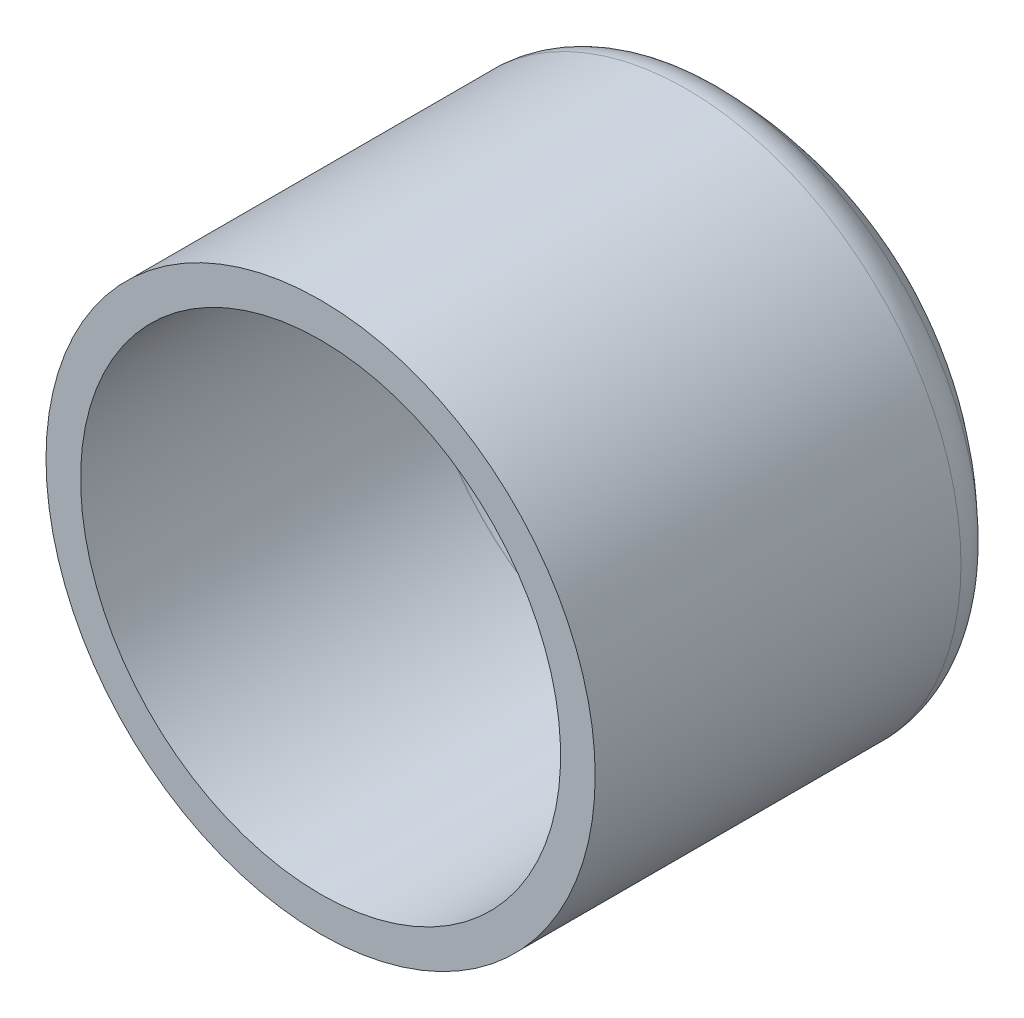
ISO-10303-21;
HEADER;
FILE_DESCRIPTION(('STEP AP214'),'2;1');
FILE_NAME('part.step','',(''),(''),'','','');
FILE_SCHEMA(('AUTOMOTIVE_DESIGN { 1 0 10303 214 1 1 1 1 }'));
ENDSEC;
DATA;
#1=APPLICATION_CONTEXT('core data for automotive mechanical design processes');
#2=APPLICATION_PROTOCOL_DEFINITION('international standard','automotive_design',2000,#1);
#3=PRODUCT_CONTEXT('',#1,'mechanical');
#4=PRODUCT('Part','Part','',(#3));
#5=PRODUCT_RELATED_PRODUCT_CATEGORY('part','',(#4));
#6=PRODUCT_DEFINITION_FORMATION('','',#4);
#7=PRODUCT_DEFINITION_CONTEXT('part definition',#1,'design');
#8=PRODUCT_DEFINITION('design','',#6,#7);
#9=PRODUCT_DEFINITION_SHAPE('','',#8);
#10=(LENGTH_UNIT() NAMED_UNIT(*) SI_UNIT(.MILLI.,.METRE.));
#11=(NAMED_UNIT(*) PLANE_ANGLE_UNIT() SI_UNIT($,.RADIAN.));
#12=(NAMED_UNIT(*) SI_UNIT($,.STERADIAN.) SOLID_ANGLE_UNIT());
#13=UNCERTAINTY_MEASURE_WITH_UNIT(LENGTH_MEASURE(1.E-05),#10,'distance_accuracy_value','');
#14=(GEOMETRIC_REPRESENTATION_CONTEXT(3) GLOBAL_UNCERTAINTY_ASSIGNED_CONTEXT((#13)) GLOBAL_UNIT_ASSIGNED_CONTEXT((#10,
#11,#12)) REPRESENTATION_CONTEXT('',''));
#15=CARTESIAN_POINT('',(0.,0.,0.));
#16=DIRECTION('',(0.,0.,1.));
#17=DIRECTION('',(1.,0.,0.));
#18=AXIS2_PLACEMENT_3D('',#15,#16,#17);
#19=CARTESIAN_POINT('',(0.,0.,18.8468));
#20=DIRECTION('',(0.,0.,1.));
#21=DIRECTION('',(0.,-1.,0.));
#22=AXIS2_PLACEMENT_3D('',#19,#20,#21);
#23=SPHERICAL_SURFACE('',#22,50.8);
#24=CARTESIAN_POINT('',(0.,0.,-19.6841589978158));
#25=DIRECTION('',(0.,0.,1.));
#26=DIRECTION('',(0.,-1.,0.));
#27=AXIS2_PLACEMENT_3D('',#24,#25,#26);
#28=CIRCLE('',#27,33.1059692307692);
#29=CARTESIAN_POINT('',(0.,-33.1059692307692,-19.6841589978158));
#30=VERTEX_POINT('',#29);
#31=EDGE_CURVE('E50',#30,#30,#28,.T.);
#32=ORIENTED_EDGE('',*,*,#31,.T.);
#33=EDGE_LOOP('',(#32));
#34=FACE_BOUND('',#33,.T.);
#35=ADVANCED_FACE('F36',(#34),#23,.F.);
#36=CARTESIAN_POINT('',(0.,0.,-12.4596041857253));
#37=DIRECTION('',(0.,0.,1.));
#38=DIRECTION('',(0.,-1.,0.));
#39=AXIS2_PLACEMENT_3D('',#36,#37,#38);
#40=TOROIDAL_SURFACE('',#39,26.8986,9.525);
#41=CARTESIAN_POINT('',(0.,0.,-12.4596041857253));
#42=DIRECTION('',(0.,0.,1.));
#43=DIRECTION('',(0.,-1.,0.));
#44=AXIS2_PLACEMENT_3D('',#41,#42,#43);
#45=CIRCLE('',#44,36.4236);
#46=CARTESIAN_POINT('',(0.,-36.4236,-12.4596041857253));
#47=VERTEX_POINT('',#46);
#48=EDGE_CURVE('E56',#47,#47,#45,.T.);
#49=ORIENTED_EDGE('',*,*,#48,.T.);
#50=EDGE_LOOP('',(#49));
#51=FACE_BOUND('',#50,.T.);
#52=ORIENTED_EDGE('',*,*,#31,.F.);
#53=EDGE_LOOP('',(#52));
#54=FACE_BOUND('',#53,.T.);
#55=ADVANCED_FACE('F88',(#51,#54),#40,.F.);
#56=CARTESIAN_POINT('',(0.,0.,38.4048));
#57=DIRECTION('',(0.,0.,1.));
#58=DIRECTION('',(0.,-1.,0.));
#59=AXIS2_PLACEMENT_3D('',#56,#57,#58);
#60=CYLINDRICAL_SURFACE('',#59,36.4236);
#61=CARTESIAN_POINT('',(0.,0.,-12.3952));
#62=DIRECTION('',(0.,0.,1.));
#63=DIRECTION('',(0.,-1.,0.));
#64=AXIS2_PLACEMENT_3D('',#61,#62,#63);
#65=CIRCLE('',#64,36.4236);
#66=CARTESIAN_POINT('',(0.,-36.4236,-12.3952));
#67=VERTEX_POINT('',#66);
#68=EDGE_CURVE('E62',#67,#67,#65,.T.);
#69=ORIENTED_EDGE('',*,*,#68,.T.);
#70=EDGE_LOOP('',(#69));
#71=FACE_BOUND('',#70,.T.);
#72=ORIENTED_EDGE('',*,*,#48,.F.);
#73=EDGE_LOOP('',(#72));
#74=FACE_BOUND('',#73,.T.);
#75=ADVANCED_FACE('F93',(#71,#74),#60,.F.);
#76=CARTESIAN_POINT('',(0.,0.,-12.3952));
#77=DIRECTION('',(0.,0.,1.));
#78=DIRECTION('',(0.,-1.,0.));
#79=AXIS2_PLACEMENT_3D('',#76,#77,#78);
#80=CONICAL_SURFACE('',#79,36.4236,0.00524995176642255);
#81=CARTESIAN_POINT('',(0.,0.,38.4048));
#82=DIRECTION('',(0.,0.,1.));
#83=DIRECTION('',(0.,-1.,0.));
#84=AXIS2_PLACEMENT_3D('',#81,#82,#83);
#85=CIRCLE('',#84,36.6903);
#86=CARTESIAN_POINT('',(0.,-36.6903,38.4048));
#87=VERTEX_POINT('',#86);
#88=EDGE_CURVE('E65',#87,#87,#85,.T.);
#89=ORIENTED_EDGE('',*,*,#88,.T.);
#90=EDGE_LOOP('',(#89));
#91=FACE_BOUND('',#90,.T.);
#92=ORIENTED_EDGE('',*,*,#68,.F.);
#93=EDGE_LOOP('',(#92));
#94=FACE_BOUND('',#93,.T.);
#95=ADVANCED_FACE('F85',(#91,#94),#80,.F.);
#96=CARTESIAN_POINT('',(0.,-36.6903,38.4048));
#97=DIRECTION('',(0.,0.,1.));
#98=DIRECTION('',(0.,-1.,0.));
#99=AXIS2_PLACEMENT_3D('',#96,#97,#98);
#100=PLANE('',#99);
#101=CARTESIAN_POINT('',(0.,0.,38.4048));
#102=DIRECTION('',(0.,0.,1.));
#103=DIRECTION('',(0.,-1.,0.));
#104=AXIS2_PLACEMENT_3D('',#101,#102,#103);
#105=CIRCLE('',#104,41.9735);
#106=CARTESIAN_POINT('',(0.,-41.9735,38.4048));
#107=VERTEX_POINT('',#106);
#108=EDGE_CURVE('E68',#107,#107,#105,.T.);
#109=ORIENTED_EDGE('',*,*,#108,.T.);
#110=EDGE_LOOP('',(#109));
#111=FACE_BOUND('',#110,.T.);
#112=ORIENTED_EDGE('',*,*,#88,.F.);
#113=EDGE_LOOP('',(#112));
#114=FACE_BOUND('',#113,.T.);
#115=ADVANCED_FACE('F73',(#111,#114),#100,.T.);
#116=CARTESIAN_POINT('',(0.,0.,38.4048));
#117=DIRECTION('',(0.,0.,1.));
#118=DIRECTION('',(0.,-1.,0.));
#119=AXIS2_PLACEMENT_3D('',#116,#117,#118);
#120=CYLINDRICAL_SURFACE('',#119,41.9735);
#121=CARTESIAN_POINT('',(0.,0.,-17.5116808581162));
#122=DIRECTION('',(0.,0.,1.));
#123=DIRECTION('',(0.,-1.,0.));
#124=AXIS2_PLACEMENT_3D('',#121,#122,#123);
#125=CIRCLE('',#124,41.9735);
#126=CARTESIAN_POINT('',(0.,-41.9735,-17.5116808581162));
#127=VERTEX_POINT('',#126);
#128=EDGE_CURVE('E44',#127,#127,#125,.T.);
#129=ORIENTED_EDGE('',*,*,#128,.T.);
#130=EDGE_LOOP('',(#129));
#131=FACE_BOUND('',#130,.T.);
#132=ORIENTED_EDGE('',*,*,#108,.F.);
#133=EDGE_LOOP('',(#132));
#134=FACE_BOUND('',#133,.T.);
#135=ADVANCED_FACE('F76',(#131,#134),#120,.T.);
#136=CARTESIAN_POINT('',(0.,0.,18.8468));
#137=DIRECTION('',(0.,0.,1.));
#138=DIRECTION('',(0.,-1.,0.));
#139=AXIS2_PLACEMENT_3D('',#136,#137,#138);
#140=SPHERICAL_SURFACE('',#139,57.2516);
#141=CARTESIAN_POINT('',(0.,0.,-22.0474194881207));
#142=DIRECTION('',(0.,0.,1.));
#143=DIRECTION('',(0.,-1.,0.));
#144=AXIS2_PLACEMENT_3D('',#141,#142,#143);
#145=CIRCLE('',#144,40.0675494011976);
#146=CARTESIAN_POINT('',(0.,-40.0675494011976,-22.0474194881207));
#147=VERTEX_POINT('',#146);
#148=EDGE_CURVE('E10',#147,#147,#145,.F.);
#149=ORIENTED_EDGE('',*,*,#148,.T.);
#150=EDGE_LOOP('',(#149));
#151=FACE_BOUND('',#150,.T.);
#152=ADVANCED_FACE('F78',(#151),#140,.T.);
#153=CARTESIAN_POINT('',(0.,0.,-17.5116808581162));
#154=DIRECTION('',(0.,0.,1.));
#155=DIRECTION('',(0.,-1.,0.));
#156=AXIS2_PLACEMENT_3D('',#153,#154,#155);
#157=TOROIDAL_SURFACE('',#156,35.6235,6.35);
#158=ORIENTED_EDGE('',*,*,#148,.F.);
#159=EDGE_LOOP('',(#158));
#160=FACE_BOUND('',#159,.T.);
#161=ORIENTED_EDGE('',*,*,#128,.F.);
#162=EDGE_LOOP('',(#161));
#163=FACE_BOUND('',#162,.T.);
#164=ADVANCED_FACE('F38',(#160,#163),#157,.T.);
#165=CLOSED_SHELL('',(#35,#55,#75,#95,#115,#135,#152,#164));
#166=MANIFOLD_SOLID_BREP('B2',#165);
#167=ADVANCED_BREP_SHAPE_REPRESENTATION('',(#18,#166),#14);
#168=SHAPE_DEFINITION_REPRESENTATION(#9,#167);
ENDSEC;
END-ISO-10303-21;
